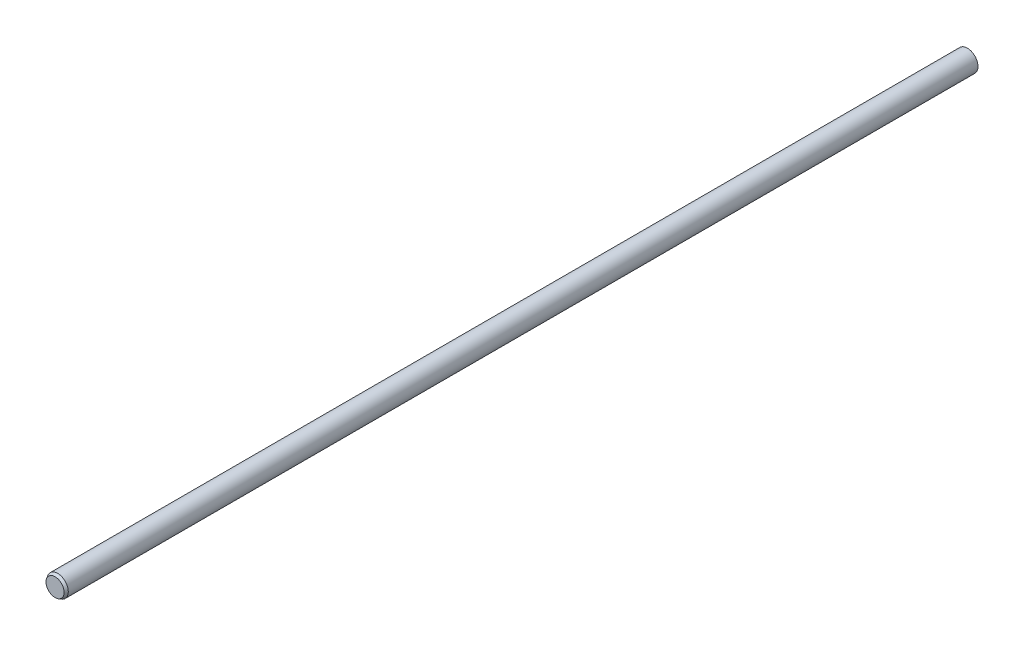
ISO-10303-21;
HEADER;
FILE_DESCRIPTION(('STEP AP214'),'2;1');
FILE_NAME('part.step','',(''),(''),'','','');
FILE_SCHEMA(('AUTOMOTIVE_DESIGN { 1 0 10303 214 1 1 1 1 }'));
ENDSEC;
DATA;
#1=APPLICATION_CONTEXT('core data for automotive mechanical design processes');
#2=APPLICATION_PROTOCOL_DEFINITION('international standard','automotive_design',2000,#1);
#3=PRODUCT_CONTEXT('',#1,'mechanical');
#4=PRODUCT('Part','Part','',(#3));
#5=PRODUCT_RELATED_PRODUCT_CATEGORY('part','',(#4));
#6=PRODUCT_DEFINITION_FORMATION('','',#4);
#7=PRODUCT_DEFINITION_CONTEXT('part definition',#1,'design');
#8=PRODUCT_DEFINITION('design','',#6,#7);
#9=PRODUCT_DEFINITION_SHAPE('','',#8);
#10=(LENGTH_UNIT() NAMED_UNIT(*) SI_UNIT(.MILLI.,.METRE.));
#11=(NAMED_UNIT(*) PLANE_ANGLE_UNIT() SI_UNIT($,.RADIAN.));
#12=(NAMED_UNIT(*) SI_UNIT($,.STERADIAN.) SOLID_ANGLE_UNIT());
#13=UNCERTAINTY_MEASURE_WITH_UNIT(LENGTH_MEASURE(1.E-05),#10,'distance_accuracy_value','');
#14=(GEOMETRIC_REPRESENTATION_CONTEXT(3) GLOBAL_UNCERTAINTY_ASSIGNED_CONTEXT((#13)) GLOBAL_UNIT_ASSIGNED_CONTEXT((#10,
#11,#12)) REPRESENTATION_CONTEXT('',''));
#15=CARTESIAN_POINT('',(0.,0.,0.));
#16=DIRECTION('',(0.,0.,1.));
#17=DIRECTION('',(1.,0.,0.));
#18=AXIS2_PLACEMENT_3D('',#15,#16,#17);
#19=CARTESIAN_POINT('',(0.,0.,345.));
#20=DIRECTION('',(0.,0.,-1.));
#21=DIRECTION('',(-1.,0.,0.));
#22=AXIS2_PLACEMENT_3D('',#19,#20,#21);
#23=CYLINDRICAL_SURFACE('',#22,4.);
#24=CARTESIAN_POINT('',(0.,0.,0.577350269189647));
#25=DIRECTION('',(0.,0.,1.));
#26=DIRECTION('',(1.,0.,0.));
#27=AXIS2_PLACEMENT_3D('',#24,#25,#26);
#28=CIRCLE('',#27,4.);
#29=CARTESIAN_POINT('',(4.,0.,0.577350269189647));
#30=VERTEX_POINT('',#29);
#31=EDGE_CURVE('E48',#30,#30,#28,.T.);
#32=ORIENTED_EDGE('',*,*,#31,.T.);
#33=EDGE_LOOP('',(#32));
#34=FACE_BOUND('',#33,.T.);
#35=CARTESIAN_POINT('',(0.,0.,344.));
#36=DIRECTION('',(0.,0.,1.));
#37=DIRECTION('',(1.,0.,0.));
#38=AXIS2_PLACEMENT_3D('',#35,#36,#37);
#39=CIRCLE('',#38,4.);
#40=CARTESIAN_POINT('',(4.,0.,344.));
#41=VERTEX_POINT('',#40);
#42=EDGE_CURVE('E55',#41,#41,#39,.F.);
#43=ORIENTED_EDGE('',*,*,#42,.T.);
#44=EDGE_LOOP('',(#43));
#45=FACE_BOUND('',#44,.T.);
#46=ADVANCED_FACE('F40',(#34,#45),#23,.T.);
#47=CARTESIAN_POINT('',(0.,0.,345.));
#48=DIRECTION('',(0.,0.,1.));
#49=DIRECTION('',(1.,0.,0.));
#50=AXIS2_PLACEMENT_3D('',#47,#48,#49);
#51=PLANE('',#50);
#52=CARTESIAN_POINT('',(0.,0.,345.));
#53=DIRECTION('',(0.,0.,1.));
#54=DIRECTION('',(1.,0.,0.));
#55=AXIS2_PLACEMENT_3D('',#52,#53,#54);
#56=CIRCLE('',#55,3.42264973081041);
#57=CARTESIAN_POINT('',(3.42264973081041,0.,345.));
#58=VERTEX_POINT('',#57);
#59=EDGE_CURVE('E10',#58,#58,#56,.T.);
#60=ORIENTED_EDGE('',*,*,#59,.T.);
#61=EDGE_LOOP('',(#60));
#62=FACE_BOUND('',#61,.T.);
#63=ADVANCED_FACE('F68',(#62),#51,.T.);
#64=CARTESIAN_POINT('',(0.,0.,0.));
#65=DIRECTION('',(0.,0.,1.));
#66=DIRECTION('',(1.,0.,0.));
#67=AXIS2_PLACEMENT_3D('',#64,#65,#66);
#68=PLANE('',#67);
#69=CARTESIAN_POINT('',(0.,0.,0.));
#70=DIRECTION('',(0.,0.,1.));
#71=DIRECTION('',(1.,0.,0.));
#72=AXIS2_PLACEMENT_3D('',#69,#70,#71);
#73=CIRCLE('',#72,2.99999999999995);
#74=CARTESIAN_POINT('',(2.99999999999995,0.,0.));
#75=VERTEX_POINT('',#74);
#76=EDGE_CURVE('E42',#75,#75,#73,.F.);
#77=ORIENTED_EDGE('',*,*,#76,.T.);
#78=EDGE_LOOP('',(#77));
#79=FACE_BOUND('',#78,.T.);
#80=ADVANCED_FACE('F63',(#79),#68,.F.);
#81=CARTESIAN_POINT('',(0.,0.,0.577350269189647));
#82=DIRECTION('',(0.,0.,1.));
#83=DIRECTION('',(1.,0.,0.));
#84=AXIS2_PLACEMENT_3D('',#81,#82,#83);
#85=CONICAL_SURFACE('',#84,4.,1.0471975511966);
#86=ORIENTED_EDGE('',*,*,#76,.F.);
#87=EDGE_LOOP('',(#86));
#88=FACE_BOUND('',#87,.T.);
#89=ORIENTED_EDGE('',*,*,#31,.F.);
#90=EDGE_LOOP('',(#89));
#91=FACE_BOUND('',#90,.T.);
#92=ADVANCED_FACE('F62',(#88,#91),#85,.T.);
#93=CARTESIAN_POINT('',(0.,0.,345.));
#94=DIRECTION('',(0.,0.,-1.));
#95=DIRECTION('',(-1.,0.,0.));
#96=AXIS2_PLACEMENT_3D('',#93,#94,#95);
#97=CONICAL_SURFACE('',#96,3.42264973081041,0.523598775598294);
#98=ORIENTED_EDGE('',*,*,#42,.F.);
#99=EDGE_LOOP('',(#98));
#100=FACE_BOUND('',#99,.T.);
#101=ORIENTED_EDGE('',*,*,#59,.F.);
#102=EDGE_LOOP('',(#101));
#103=FACE_BOUND('',#102,.T.);
#104=ADVANCED_FACE('F39',(#100,#103),#97,.T.);
#105=CLOSED_SHELL('',(#46,#63,#80,#92,#104));
#106=MANIFOLD_SOLID_BREP('B2',#105);
#107=ADVANCED_BREP_SHAPE_REPRESENTATION('',(#18,#106),#14);
#108=SHAPE_DEFINITION_REPRESENTATION(#9,#107);
ENDSEC;
END-ISO-10303-21;
